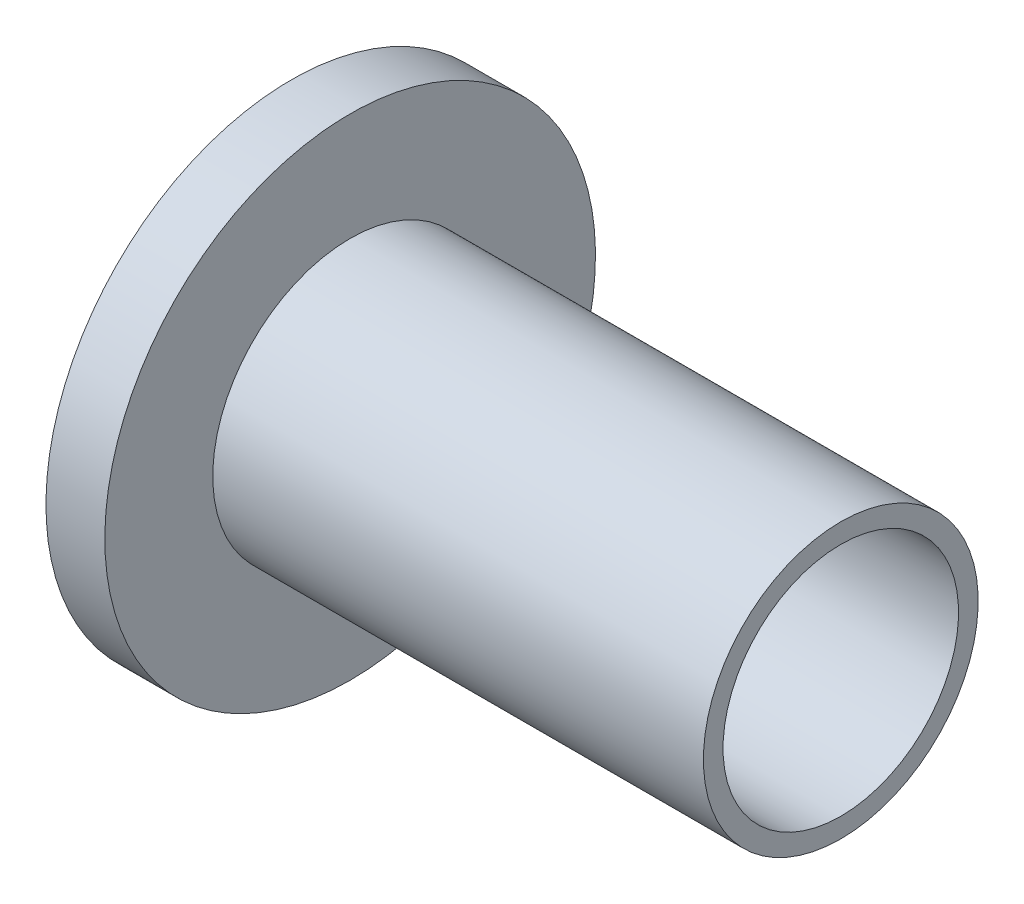
ISO-10303-21;
HEADER;
FILE_DESCRIPTION(('STEP AP214'),'2;1');
FILE_NAME('part.step','',(''),(''),'','','');
FILE_SCHEMA(('AUTOMOTIVE_DESIGN { 1 0 10303 214 1 1 1 1 }'));
ENDSEC;
DATA;
#1=APPLICATION_CONTEXT('core data for automotive mechanical design processes');
#2=APPLICATION_PROTOCOL_DEFINITION('international standard','automotive_design',2000,#1);
#3=PRODUCT_CONTEXT('',#1,'mechanical');
#4=PRODUCT('Part','Part','',(#3));
#5=PRODUCT_RELATED_PRODUCT_CATEGORY('part','',(#4));
#6=PRODUCT_DEFINITION_FORMATION('','',#4);
#7=PRODUCT_DEFINITION_CONTEXT('part definition',#1,'design');
#8=PRODUCT_DEFINITION('design','',#6,#7);
#9=PRODUCT_DEFINITION_SHAPE('','',#8);
#10=(LENGTH_UNIT() NAMED_UNIT(*) SI_UNIT(.MILLI.,.METRE.));
#11=(NAMED_UNIT(*) PLANE_ANGLE_UNIT() SI_UNIT($,.RADIAN.));
#12=(NAMED_UNIT(*) SI_UNIT($,.STERADIAN.) SOLID_ANGLE_UNIT());
#13=UNCERTAINTY_MEASURE_WITH_UNIT(LENGTH_MEASURE(1.E-05),#10,'distance_accuracy_value','');
#14=(GEOMETRIC_REPRESENTATION_CONTEXT(3) GLOBAL_UNCERTAINTY_ASSIGNED_CONTEXT((#13)) GLOBAL_UNIT_ASSIGNED_CONTEXT((#10,
#11,#12)) REPRESENTATION_CONTEXT('',''));
#15=CARTESIAN_POINT('',(0.,0.,0.));
#16=DIRECTION('',(0.,0.,1.));
#17=DIRECTION('',(1.,0.,0.));
#18=AXIS2_PLACEMENT_3D('',#15,#16,#17);
#19=CARTESIAN_POINT('',(-64.9001174574378,0.,0.));
#20=DIRECTION('',(-1.,0.,0.));
#21=DIRECTION('',(0.,-1.,0.));
#22=AXIS2_PLACEMENT_3D('',#19,#20,#21);
#23=CYLINDRICAL_SURFACE('',#22,25.);
#24=CARTESIAN_POINT('',(0.,0.,0.));
#25=DIRECTION('',(-1.,0.,0.));
#26=DIRECTION('',(0.,-1.,0.));
#27=AXIS2_PLACEMENT_3D('',#24,#25,#26);
#28=CIRCLE('',#27,25.);
#29=CARTESIAN_POINT('',(0.,-25.,0.));
#30=VERTEX_POINT('',#29);
#31=EDGE_CURVE('E11',#30,#30,#28,.T.);
#32=ORIENTED_EDGE('',*,*,#31,.F.);
#33=EDGE_LOOP('',(#32));
#34=FACE_BOUND('',#33,.T.);
#35=CARTESIAN_POINT('',(6.00000000000001,0.,0.));
#36=DIRECTION('',(-1.,0.,0.));
#37=DIRECTION('',(0.,-1.,0.));
#38=AXIS2_PLACEMENT_3D('',#35,#36,#37);
#39=CIRCLE('',#38,25.);
#40=CARTESIAN_POINT('',(6.00000000000001,-25.,0.));
#41=VERTEX_POINT('',#40);
#42=EDGE_CURVE('E121',#41,#41,#39,.T.);
#43=ORIENTED_EDGE('',*,*,#42,.T.);
#44=EDGE_LOOP('',(#43));
#45=FACE_BOUND('',#44,.T.);
#46=ADVANCED_FACE('F37',(#34,#45),#23,.T.);
#47=CARTESIAN_POINT('',(0.,25.,0.));
#48=DIRECTION('',(1.,0.,0.));
#49=DIRECTION('',(0.,1.,0.));
#50=AXIS2_PLACEMENT_3D('',#47,#48,#49);
#51=PLANE('',#50);
#52=CARTESIAN_POINT('',(0.,0.,0.));
#53=DIRECTION('',(-1.,0.,0.));
#54=DIRECTION('',(0.,-1.,0.));
#55=AXIS2_PLACEMENT_3D('',#52,#53,#54);
#56=CIRCLE('',#55,10.);
#57=CARTESIAN_POINT('',(0.,-10.,0.));
#58=VERTEX_POINT('',#57);
#59=EDGE_CURVE('E44',#58,#58,#56,.T.);
#60=ORIENTED_EDGE('',*,*,#59,.F.);
#61=EDGE_LOOP('',(#60));
#62=FACE_BOUND('',#61,.T.);
#63=ORIENTED_EDGE('',*,*,#31,.T.);
#64=EDGE_LOOP('',(#63));
#65=FACE_BOUND('',#64,.T.);
#66=ADVANCED_FACE('F143',(#62,#65),#51,.F.);
#67=CARTESIAN_POINT('',(-64.9001174574378,0.,0.));
#68=DIRECTION('',(-1.,0.,0.));
#69=DIRECTION('',(0.,-1.,0.));
#70=AXIS2_PLACEMENT_3D('',#67,#68,#69);
#71=CYLINDRICAL_SURFACE('',#70,10.);
#72=CARTESIAN_POINT('',(19.,0.,0.));
#73=DIRECTION('',(-1.,0.,0.));
#74=DIRECTION('',(0.,-1.,0.));
#75=AXIS2_PLACEMENT_3D('',#72,#73,#74);
#76=CIRCLE('',#75,10.);
#77=CARTESIAN_POINT('',(19.,-7.59934207678536,6.5));
#78=VERTEX_POINT('',#77);
#79=CARTESIAN_POINT('',(19.,-7.59934207678536,-6.5));
#80=VERTEX_POINT('',#79);
#81=EDGE_CURVE('E136',#78,#80,#76,.T.);
#82=ORIENTED_EDGE('',*,*,#81,.F.);
#83=DIRECTION('',(-1.,0.,0.));
#84=VECTOR('',#83,1.);
#85=CARTESIAN_POINT('',(-64.9001174574378,-7.59934207678536,6.50000000000001));
#86=LINE('',#85,#84);
#87=CARTESIAN_POINT('',(11.,-7.59934207678536,6.5));
#88=VERTEX_POINT('',#87);
#89=EDGE_CURVE('E108',#88,#78,#86,.F.);
#90=ORIENTED_EDGE('',*,*,#89,.F.);
#91=CARTESIAN_POINT('',(11.,0.,0.));
#92=DIRECTION('',(-1.,0.,0.));
#93=DIRECTION('',(0.,0.,1.));
#94=AXIS2_PLACEMENT_3D('',#91,#92,#93);
#95=CIRCLE('',#94,10.);
#96=CARTESIAN_POINT('',(11.,-7.59934207678534,-6.50000000000001));
#97=VERTEX_POINT('',#96);
#98=EDGE_CURVE('E105',#97,#88,#95,.T.);
#99=ORIENTED_EDGE('',*,*,#98,.F.);
#100=DIRECTION('',(-1.,0.,0.));
#101=VECTOR('',#100,1.);
#102=CARTESIAN_POINT('',(-64.9001174574378,-7.59934207678536,-6.50000000000001));
#103=LINE('',#102,#101);
#104=EDGE_CURVE('E99',#80,#97,#103,.T.);
#105=ORIENTED_EDGE('',*,*,#104,.F.);
#106=EDGE_LOOP('',(#82,#90,#99,#105));
#107=FACE_BOUND('',#106,.T.);
#108=ORIENTED_EDGE('',*,*,#59,.T.);
#109=EDGE_LOOP('',(#108));
#110=FACE_BOUND('',#109,.T.);
#111=ADVANCED_FACE('F141',(#107,#110),#71,.F.);
#112=CARTESIAN_POINT('',(19.,12.,0.));
#113=DIRECTION('',(-1.,0.,0.));
#114=DIRECTION('',(0.,-1.,0.));
#115=AXIS2_PLACEMENT_3D('',#112,#113,#114);
#116=PLANE('',#115);
#117=CARTESIAN_POINT('',(19.,0.,0.));
#118=DIRECTION('',(-1.,0.,0.));
#119=DIRECTION('',(0.,-1.,0.));
#120=AXIS2_PLACEMENT_3D('',#117,#118,#119);
#121=CIRCLE('',#120,12.);
#122=CARTESIAN_POINT('',(19.,-10.087120500916,6.5));
#123=VERTEX_POINT('',#122);
#124=CARTESIAN_POINT('',(19.,-10.087120500916,-6.49999999999999));
#125=VERTEX_POINT('',#124);
#126=EDGE_CURVE('E133',#123,#125,#121,.T.);
#127=ORIENTED_EDGE('',*,*,#126,.F.);
#128=DIRECTION('',(0.,1.,0.));
#129=VECTOR('',#128,1.);
#130=CARTESIAN_POINT('',(19.,-25.001,6.5));
#131=LINE('',#130,#129);
#132=EDGE_CURVE('E115',#123,#78,#131,.T.);
#133=ORIENTED_EDGE('',*,*,#132,.T.);
#134=ORIENTED_EDGE('',*,*,#81,.T.);
#135=DIRECTION('',(0.,1.,0.));
#136=VECTOR('',#135,1.);
#137=CARTESIAN_POINT('',(19.,-25.001,-6.5));
#138=LINE('',#137,#136);
#139=EDGE_CURVE('E92',#125,#80,#138,.T.);
#140=ORIENTED_EDGE('',*,*,#139,.F.);
#141=EDGE_LOOP('',(#127,#133,#134,#140));
#142=FACE_BOUND('',#141,.T.);
#143=ADVANCED_FACE('F171',(#142),#116,.F.);
#144=CARTESIAN_POINT('',(-64.9001174574378,0.,0.));
#145=DIRECTION('',(-1.,0.,0.));
#146=DIRECTION('',(0.,-1.,0.));
#147=AXIS2_PLACEMENT_3D('',#144,#145,#146);
#148=CYLINDRICAL_SURFACE('',#147,12.);
#149=CARTESIAN_POINT('',(56.,0.,0.));
#150=DIRECTION('',(-1.,0.,0.));
#151=DIRECTION('',(0.,-1.,0.));
#152=AXIS2_PLACEMENT_3D('',#149,#150,#151);
#153=CIRCLE('',#152,12.);
#154=CARTESIAN_POINT('',(56.,-12.,0.));
#155=VERTEX_POINT('',#154);
#156=EDGE_CURVE('E130',#155,#155,#153,.T.);
#157=ORIENTED_EDGE('',*,*,#156,.F.);
#158=EDGE_LOOP('',(#157));
#159=FACE_BOUND('',#158,.T.);
#160=ORIENTED_EDGE('',*,*,#126,.T.);
#161=CARTESIAN_POINT('',(19.,0.,0.));
#162=DIRECTION('',(1.,0.,0.));
#163=DIRECTION('',(0.,0.,-1.));
#164=AXIS2_PLACEMENT_3D('',#161,#162,#163);
#165=CIRCLE('',#164,12.);
#166=EDGE_CURVE('E88',#125,#123,#165,.F.);
#167=ORIENTED_EDGE('',*,*,#166,.T.);
#168=EDGE_LOOP('',(#160,#167));
#169=FACE_BOUND('',#168,.T.);
#170=ADVANCED_FACE('F165',(#159,#169),#148,.F.);
#171=CARTESIAN_POINT('',(56.,12.,0.));
#172=DIRECTION('',(-1.,0.,0.));
#173=DIRECTION('',(0.,-1.,0.));
#174=AXIS2_PLACEMENT_3D('',#171,#172,#173);
#175=PLANE('',#174);
#176=CARTESIAN_POINT('',(56.,0.,0.));
#177=DIRECTION('',(-1.,0.,0.));
#178=DIRECTION('',(0.,-1.,0.));
#179=AXIS2_PLACEMENT_3D('',#176,#177,#178);
#180=CIRCLE('',#179,14.);
#181=CARTESIAN_POINT('',(56.,-14.,0.));
#182=VERTEX_POINT('',#181);
#183=EDGE_CURVE('E127',#182,#182,#180,.T.);
#184=ORIENTED_EDGE('',*,*,#183,.F.);
#185=EDGE_LOOP('',(#184));
#186=FACE_BOUND('',#185,.T.);
#187=ORIENTED_EDGE('',*,*,#156,.T.);
#188=EDGE_LOOP('',(#187));
#189=FACE_BOUND('',#188,.T.);
#190=ADVANCED_FACE('F159',(#186,#189),#175,.F.);
#191=CARTESIAN_POINT('',(-64.9001174574378,0.,0.));
#192=DIRECTION('',(-1.,0.,0.));
#193=DIRECTION('',(0.,-1.,0.));
#194=AXIS2_PLACEMENT_3D('',#191,#192,#193);
#195=CYLINDRICAL_SURFACE('',#194,14.);
#196=DIRECTION('',(-1.,0.,0.));
#197=VECTOR('',#196,1.);
#198=CARTESIAN_POINT('',(-64.9001174574378,-12.3995967676373,6.50000000000001));
#199=LINE('',#198,#197);
#200=CARTESIAN_POINT('',(19.,-12.3995967676373,6.5));
#201=VERTEX_POINT('',#200);
#202=CARTESIAN_POINT('',(11.,-12.3995967676373,6.5));
#203=VERTEX_POINT('',#202);
#204=EDGE_CURVE('E104',#201,#203,#199,.T.);
#205=ORIENTED_EDGE('',*,*,#204,.F.);
#206=CARTESIAN_POINT('',(19.,0.,0.));
#207=DIRECTION('',(1.,0.,0.));
#208=DIRECTION('',(0.,0.,-1.));
#209=AXIS2_PLACEMENT_3D('',#206,#207,#208);
#210=CIRCLE('',#209,14.);
#211=CARTESIAN_POINT('',(19.,-12.3995967676372,-6.50000000000001));
#212=VERTEX_POINT('',#211);
#213=EDGE_CURVE('E85',#212,#201,#210,.F.);
#214=ORIENTED_EDGE('',*,*,#213,.F.);
#215=DIRECTION('',(-1.,0.,0.));
#216=VECTOR('',#215,1.);
#217=CARTESIAN_POINT('',(-64.9001174574378,-12.3995967676373,-6.50000000000001));
#218=LINE('',#217,#216);
#219=CARTESIAN_POINT('',(11.,-12.3995967676372,-6.50000000000001));
#220=VERTEX_POINT('',#219);
#221=EDGE_CURVE('E95',#220,#212,#218,.F.);
#222=ORIENTED_EDGE('',*,*,#221,.F.);
#223=CARTESIAN_POINT('',(11.,0.,0.));
#224=DIRECTION('',(-1.,0.,0.));
#225=DIRECTION('',(0.,0.,1.));
#226=AXIS2_PLACEMENT_3D('',#223,#224,#225);
#227=CIRCLE('',#226,14.);
#228=EDGE_CURVE('E59',#203,#220,#227,.F.);
#229=ORIENTED_EDGE('',*,*,#228,.F.);
#230=EDGE_LOOP('',(#205,#214,#222,#229));
#231=FACE_BOUND('',#230,.T.);
#232=CARTESIAN_POINT('',(6.00000000000001,0.,0.));
#233=DIRECTION('',(-1.,0.,0.));
#234=DIRECTION('',(0.,-1.,0.));
#235=AXIS2_PLACEMENT_3D('',#232,#233,#234);
#236=CIRCLE('',#235,14.);
#237=CARTESIAN_POINT('',(6.00000000000001,-14.,0.));
#238=VERTEX_POINT('',#237);
#239=EDGE_CURVE('E124',#238,#238,#236,.T.);
#240=ORIENTED_EDGE('',*,*,#239,.F.);
#241=EDGE_LOOP('',(#240));
#242=FACE_BOUND('',#241,.T.);
#243=ORIENTED_EDGE('',*,*,#183,.T.);
#244=EDGE_LOOP('',(#243));
#245=FACE_BOUND('',#244,.T.);
#246=ADVANCED_FACE('F101',(#231,#242,#245),#195,.T.);
#247=CARTESIAN_POINT('',(6.00000000000001,14.,0.));
#248=DIRECTION('',(-1.,0.,0.));
#249=DIRECTION('',(0.,-1.,0.));
#250=AXIS2_PLACEMENT_3D('',#247,#248,#249);
#251=PLANE('',#250);
#252=ORIENTED_EDGE('',*,*,#42,.F.);
#253=EDGE_LOOP('',(#252));
#254=FACE_BOUND('',#253,.T.);
#255=ORIENTED_EDGE('',*,*,#239,.T.);
#256=EDGE_LOOP('',(#255));
#257=FACE_BOUND('',#256,.T.);
#258=ADVANCED_FACE('F152',(#254,#257),#251,.F.);
#259=CARTESIAN_POINT('',(19.,-25.001,6.5));
#260=DIRECTION('',(1.,0.,0.));
#261=DIRECTION('',(0.,0.,-1.));
#262=AXIS2_PLACEMENT_3D('',#259,#260,#261);
#263=PLANE('',#262);
#264=EDGE_CURVE('E81',#212,#125,#138,.T.);
#265=ORIENTED_EDGE('',*,*,#264,.F.);
#266=ORIENTED_EDGE('',*,*,#213,.T.);
#267=EDGE_CURVE('E51',#201,#123,#131,.T.);
#268=ORIENTED_EDGE('',*,*,#267,.T.);
#269=ORIENTED_EDGE('',*,*,#166,.F.);
#270=EDGE_LOOP('',(#265,#266,#268,#269));
#271=FACE_BOUND('',#270,.T.);
#272=ADVANCED_FACE('F83',(#271),#263,.F.);
#273=CARTESIAN_POINT('',(19.,-25.001,6.5));
#274=DIRECTION('',(0.,0.,1.));
#275=DIRECTION('',(1.,0.,0.));
#276=AXIS2_PLACEMENT_3D('',#273,#274,#275);
#277=PLANE('',#276);
#278=ORIENTED_EDGE('',*,*,#89,.T.);
#279=ORIENTED_EDGE('',*,*,#132,.F.);
#280=ORIENTED_EDGE('',*,*,#267,.F.);
#281=ORIENTED_EDGE('',*,*,#204,.T.);
#282=DIRECTION('',(0.,1.,0.));
#283=VECTOR('',#282,1.);
#284=CARTESIAN_POINT('',(11.,-25.001,6.5));
#285=LINE('',#284,#283);
#286=EDGE_CURVE('E116',#203,#88,#285,.T.);
#287=ORIENTED_EDGE('',*,*,#286,.T.);
#288=EDGE_LOOP('',(#278,#279,#280,#281,#287));
#289=FACE_BOUND('',#288,.T.);
#290=ADVANCED_FACE('F183',(#289),#277,.F.);
#291=CARTESIAN_POINT('',(11.,-25.001,6.5));
#292=DIRECTION('',(-1.,0.,0.));
#293=DIRECTION('',(0.,0.,1.));
#294=AXIS2_PLACEMENT_3D('',#291,#292,#293);
#295=PLANE('',#294);
#296=ORIENTED_EDGE('',*,*,#98,.T.);
#297=ORIENTED_EDGE('',*,*,#286,.F.);
#298=ORIENTED_EDGE('',*,*,#228,.T.);
#299=DIRECTION('',(0.,1.,0.));
#300=VECTOR('',#299,1.);
#301=CARTESIAN_POINT('',(11.,-25.001,-6.5));
#302=LINE('',#301,#300);
#303=EDGE_CURVE('E91',#220,#97,#302,.T.);
#304=ORIENTED_EDGE('',*,*,#303,.T.);
#305=EDGE_LOOP('',(#296,#297,#298,#304));
#306=FACE_BOUND('',#305,.T.);
#307=ADVANCED_FACE('F181',(#306),#295,.F.);
#308=CARTESIAN_POINT('',(19.,-25.001,-6.5));
#309=DIRECTION('',(0.,0.,-1.));
#310=DIRECTION('',(-1.,0.,0.));
#311=AXIS2_PLACEMENT_3D('',#308,#309,#310);
#312=PLANE('',#311);
#313=ORIENTED_EDGE('',*,*,#104,.T.);
#314=ORIENTED_EDGE('',*,*,#303,.F.);
#315=ORIENTED_EDGE('',*,*,#221,.T.);
#316=ORIENTED_EDGE('',*,*,#264,.T.);
#317=ORIENTED_EDGE('',*,*,#139,.T.);
#318=EDGE_LOOP('',(#313,#314,#315,#316,#317));
#319=FACE_BOUND('',#318,.T.);
#320=ADVANCED_FACE('F97',(#319),#312,.F.);
#321=CLOSED_SHELL('',(#46,#66,#111,#143,#170,#190,#246,#258,#272,#290,#307,#320));
#322=MANIFOLD_SOLID_BREP('B2',#321);
#323=ADVANCED_BREP_SHAPE_REPRESENTATION('',(#18,#322),#14);
#324=SHAPE_DEFINITION_REPRESENTATION(#9,#323);
ENDSEC;
END-ISO-10303-21;
